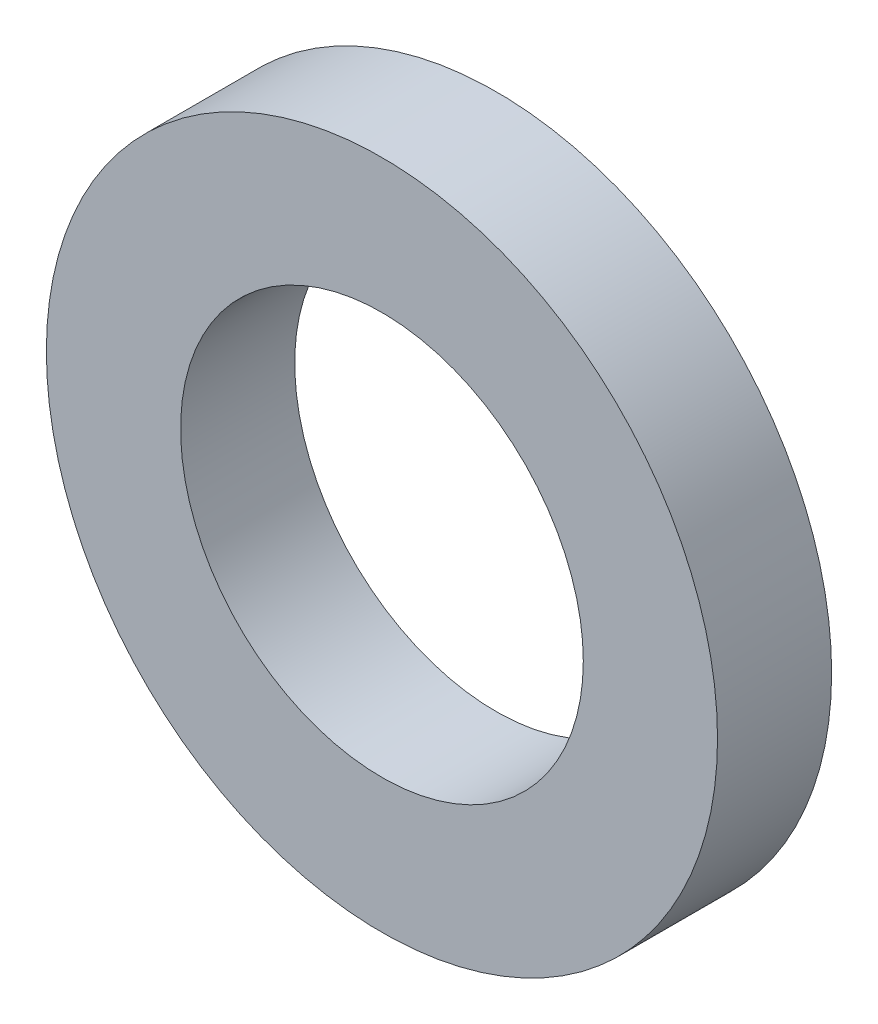
ISO-10303-21;
HEADER;
FILE_DESCRIPTION(('STEP AP214'),'2;1');
FILE_NAME('part.step','',(''),(''),'','','');
FILE_SCHEMA(('AUTOMOTIVE_DESIGN { 1 0 10303 214 1 1 1 1 }'));
ENDSEC;
DATA;
#1=APPLICATION_CONTEXT('core data for automotive mechanical design processes');
#2=APPLICATION_PROTOCOL_DEFINITION('international standard','automotive_design',2000,#1);
#3=PRODUCT_CONTEXT('',#1,'mechanical');
#4=PRODUCT('Part','Part','',(#3));
#5=PRODUCT_RELATED_PRODUCT_CATEGORY('part','',(#4));
#6=PRODUCT_DEFINITION_FORMATION('','',#4);
#7=PRODUCT_DEFINITION_CONTEXT('part definition',#1,'design');
#8=PRODUCT_DEFINITION('design','',#6,#7);
#9=PRODUCT_DEFINITION_SHAPE('','',#8);
#10=(LENGTH_UNIT() NAMED_UNIT(*) SI_UNIT(.MILLI.,.METRE.));
#11=(NAMED_UNIT(*) PLANE_ANGLE_UNIT() SI_UNIT($,.RADIAN.));
#12=(NAMED_UNIT(*) SI_UNIT($,.STERADIAN.) SOLID_ANGLE_UNIT());
#13=UNCERTAINTY_MEASURE_WITH_UNIT(LENGTH_MEASURE(1.E-05),#10,'distance_accuracy_value','');
#14=(GEOMETRIC_REPRESENTATION_CONTEXT(3) GLOBAL_UNCERTAINTY_ASSIGNED_CONTEXT((#13)) GLOBAL_UNIT_ASSIGNED_CONTEXT((#10,
#11,#12)) REPRESENTATION_CONTEXT('',''));
#15=CARTESIAN_POINT('',(0.,0.,0.));
#16=DIRECTION('',(0.,0.,1.));
#17=DIRECTION('',(1.,0.,0.));
#18=AXIS2_PLACEMENT_3D('',#15,#16,#17);
#19=CARTESIAN_POINT('',(0.,0.,1.7));
#20=DIRECTION('',(0.,0.,1.));
#21=DIRECTION('',(1.,0.,0.));
#22=AXIS2_PLACEMENT_3D('',#19,#20,#21);
#23=PLANE('',#22);
#24=CARTESIAN_POINT('',(0.,0.,1.7));
#25=DIRECTION('',(0.,0.,1.));
#26=DIRECTION('',(1.,0.,0.));
#27=AXIS2_PLACEMENT_3D('',#24,#25,#26);
#28=CIRCLE('',#27,5.);
#29=CARTESIAN_POINT('',(5.,0.,1.7));
#30=VERTEX_POINT('',#29);
#31=EDGE_CURVE('E10',#30,#30,#28,.T.);
#32=ORIENTED_EDGE('',*,*,#31,.T.);
#33=EDGE_LOOP('',(#32));
#34=FACE_BOUND('',#33,.T.);
#35=CARTESIAN_POINT('',(0.,0.,1.7));
#36=DIRECTION('',(0.,0.,1.));
#37=DIRECTION('',(1.,0.,0.));
#38=AXIS2_PLACEMENT_3D('',#35,#36,#37);
#39=CIRCLE('',#38,3.);
#40=CARTESIAN_POINT('',(3.,0.,1.7));
#41=VERTEX_POINT('',#40);
#42=EDGE_CURVE('E41',#41,#41,#39,.T.);
#43=ORIENTED_EDGE('',*,*,#42,.F.);
#44=EDGE_LOOP('',(#43));
#45=FACE_BOUND('',#44,.T.);
#46=ADVANCED_FACE('F30',(#34,#45),#23,.T.);
#47=CARTESIAN_POINT('',(0.,0.,0.));
#48=DIRECTION('',(0.,0.,1.));
#49=DIRECTION('',(1.,0.,0.));
#50=AXIS2_PLACEMENT_3D('',#47,#48,#49);
#51=PLANE('',#50);
#52=CARTESIAN_POINT('',(0.,0.,0.));
#53=DIRECTION('',(0.,0.,1.));
#54=DIRECTION('',(1.,0.,0.));
#55=AXIS2_PLACEMENT_3D('',#52,#53,#54);
#56=CIRCLE('',#55,5.);
#57=CARTESIAN_POINT('',(5.,0.,0.));
#58=VERTEX_POINT('',#57);
#59=EDGE_CURVE('E34',#58,#58,#56,.T.);
#60=ORIENTED_EDGE('',*,*,#59,.F.);
#61=EDGE_LOOP('',(#60));
#62=FACE_BOUND('',#61,.T.);
#63=CARTESIAN_POINT('',(0.,0.,0.));
#64=DIRECTION('',(0.,0.,1.));
#65=DIRECTION('',(1.,0.,0.));
#66=AXIS2_PLACEMENT_3D('',#63,#64,#65);
#67=CIRCLE('',#66,3.);
#68=CARTESIAN_POINT('',(3.,0.,0.));
#69=VERTEX_POINT('',#68);
#70=EDGE_CURVE('E43',#69,#69,#67,.T.);
#71=ORIENTED_EDGE('',*,*,#70,.T.);
#72=EDGE_LOOP('',(#71));
#73=FACE_BOUND('',#72,.T.);
#74=ADVANCED_FACE('F53',(#62,#73),#51,.F.);
#75=CARTESIAN_POINT('',(0.,0.,1.7));
#76=DIRECTION('',(0.,0.,-1.));
#77=DIRECTION('',(-1.,0.,0.));
#78=AXIS2_PLACEMENT_3D('',#75,#76,#77);
#79=CYLINDRICAL_SURFACE('',#78,5.);
#80=ORIENTED_EDGE('',*,*,#31,.F.);
#81=EDGE_LOOP('',(#80));
#82=FACE_BOUND('',#81,.T.);
#83=ORIENTED_EDGE('',*,*,#59,.T.);
#84=EDGE_LOOP('',(#83));
#85=FACE_BOUND('',#84,.T.);
#86=ADVANCED_FACE('F32',(#82,#85),#79,.T.);
#87=CARTESIAN_POINT('',(0.,0.,1.7));
#88=DIRECTION('',(0.,0.,-1.));
#89=DIRECTION('',(-1.,0.,0.));
#90=AXIS2_PLACEMENT_3D('',#87,#88,#89);
#91=CYLINDRICAL_SURFACE('',#90,3.);
#92=ORIENTED_EDGE('',*,*,#42,.T.);
#93=EDGE_LOOP('',(#92));
#94=FACE_BOUND('',#93,.T.);
#95=ORIENTED_EDGE('',*,*,#70,.F.);
#96=EDGE_LOOP('',(#95));
#97=FACE_BOUND('',#96,.T.);
#98=ADVANCED_FACE('F49',(#94,#97),#91,.F.);
#99=CLOSED_SHELL('',(#46,#74,#86,#98));
#100=MANIFOLD_SOLID_BREP('B2',#99);
#101=ADVANCED_BREP_SHAPE_REPRESENTATION('',(#18,#100),#14);
#102=SHAPE_DEFINITION_REPRESENTATION(#9,#101);
ENDSEC;
END-ISO-10303-21;
